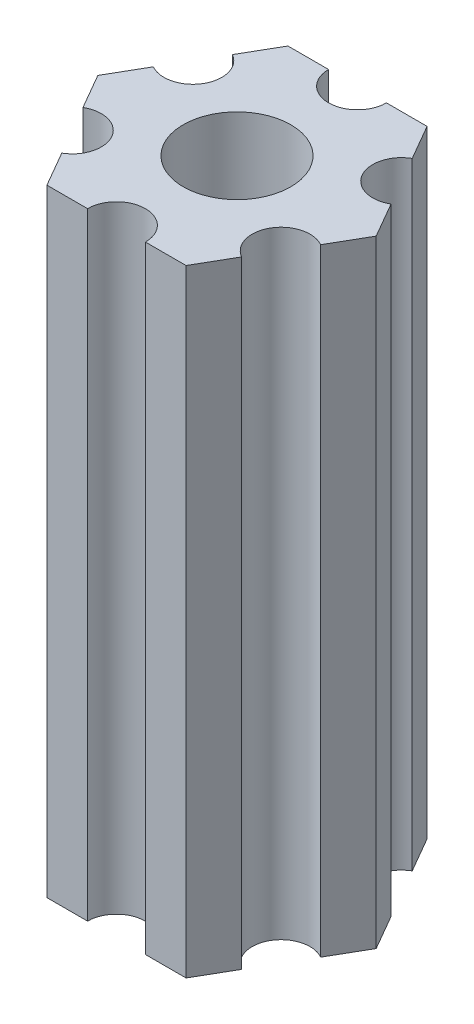
ISO-10303-21;
HEADER;
FILE_DESCRIPTION(('STEP AP214'),'2;1');
FILE_NAME('part.step','',(''),(''),'','','');
FILE_SCHEMA(('AUTOMOTIVE_DESIGN { 1 0 10303 214 1 1 1 1 }'));
ENDSEC;
DATA;
#1=APPLICATION_CONTEXT('core data for automotive mechanical design processes');
#2=APPLICATION_PROTOCOL_DEFINITION('international standard','automotive_design',2000,#1);
#3=PRODUCT_CONTEXT('',#1,'mechanical');
#4=PRODUCT('Part','Part','',(#3));
#5=PRODUCT_RELATED_PRODUCT_CATEGORY('part','',(#4));
#6=PRODUCT_DEFINITION_FORMATION('','',#4);
#7=PRODUCT_DEFINITION_CONTEXT('part definition',#1,'design');
#8=PRODUCT_DEFINITION('design','',#6,#7);
#9=PRODUCT_DEFINITION_SHAPE('','',#8);
#10=(LENGTH_UNIT() NAMED_UNIT(*) SI_UNIT(.MILLI.,.METRE.));
#11=(NAMED_UNIT(*) PLANE_ANGLE_UNIT() SI_UNIT($,.RADIAN.));
#12=(NAMED_UNIT(*) SI_UNIT($,.STERADIAN.) SOLID_ANGLE_UNIT());
#13=UNCERTAINTY_MEASURE_WITH_UNIT(LENGTH_MEASURE(1.E-05),#10,'distance_accuracy_value','');
#14=(GEOMETRIC_REPRESENTATION_CONTEXT(3) GLOBAL_UNCERTAINTY_ASSIGNED_CONTEXT((#13)) GLOBAL_UNIT_ASSIGNED_CONTEXT((#10,
#11,#12)) REPRESENTATION_CONTEXT('',''));
#15=CARTESIAN_POINT('',(0.,0.,0.));
#16=DIRECTION('',(0.,0.,1.));
#17=DIRECTION('',(1.,0.,0.));
#18=AXIS2_PLACEMENT_3D('',#15,#16,#17);
#19=CARTESIAN_POINT('',(5.41265877365274,53.,3.125));
#20=DIRECTION('',(0.,1.,0.));
#21=DIRECTION('',(0.,0.,1.));
#22=AXIS2_PLACEMENT_3D('',#19,#20,#21);
#23=CYLINDRICAL_SURFACE('',#22,1.5);
#24=CARTESIAN_POINT('',(5.41265877365274,85.,3.125));
#25=DIRECTION('',(0.,-1.,0.));
#26=DIRECTION('',(0.,0.,-1.));
#27=AXIS2_PLACEMENT_3D('',#24,#25,#26);
#28=CIRCLE('',#27,1.5);
#29=CARTESIAN_POINT('',(4.66265877365274,85.,4.42403810567666));
#30=VERTEX_POINT('',#29);
#31=CARTESIAN_POINT('',(6.16265877365274,85.,1.82596189432335));
#32=VERTEX_POINT('',#31);
#33=EDGE_CURVE('E194',#30,#32,#28,.T.);
#34=ORIENTED_EDGE('',*,*,#33,.F.);
#35=DIRECTION('',(0.,1.,0.));
#36=VECTOR('',#35,1.);
#37=CARTESIAN_POINT('',(4.66265877365274,53.,4.42403810567666));
#38=LINE('',#37,#36);
#39=CARTESIAN_POINT('',(4.66265877365274,53.,4.42403810567666));
#40=VERTEX_POINT('',#39);
#41=EDGE_CURVE('E11',#40,#30,#38,.T.);
#42=ORIENTED_EDGE('',*,*,#41,.F.);
#43=CARTESIAN_POINT('',(5.41265877365274,53.,3.125));
#44=DIRECTION('',(0.,-1.,0.));
#45=DIRECTION('',(0.,0.,-1.));
#46=AXIS2_PLACEMENT_3D('',#43,#44,#45);
#47=CIRCLE('',#46,1.5);
#48=CARTESIAN_POINT('',(6.16265877365274,53.,1.82596189432335));
#49=VERTEX_POINT('',#48);
#50=EDGE_CURVE('E245',#40,#49,#47,.T.);
#51=ORIENTED_EDGE('',*,*,#50,.T.);
#52=DIRECTION('',(0.,1.,0.));
#53=VECTOR('',#52,1.);
#54=CARTESIAN_POINT('',(6.16265877365274,53.,1.82596189432335));
#55=LINE('',#54,#53);
#56=EDGE_CURVE('E40',#49,#32,#55,.T.);
#57=ORIENTED_EDGE('',*,*,#56,.T.);
#58=EDGE_LOOP('',(#34,#42,#51,#57));
#59=FACE_BOUND('',#58,.T.);
#60=ADVANCED_FACE('F37',(#59),#23,.F.);
#61=CARTESIAN_POINT('',(3.60843918243516,53.,6.25));
#62=DIRECTION('',(0.866025403784439,0.,0.5));
#63=DIRECTION('',(0.5,0.,-0.866025403784439));
#64=AXIS2_PLACEMENT_3D('',#61,#62,#63);
#65=PLANE('',#64);
#66=DIRECTION('',(0.5,0.,-0.866025403784439));
#67=VECTOR('',#66,1.);
#68=CARTESIAN_POINT('',(3.60843918243516,85.,6.25));
#69=LINE('',#68,#67);
#70=CARTESIAN_POINT('',(3.60843918243516,85.,6.25));
#71=VERTEX_POINT('',#70);
#72=EDGE_CURVE('E243',#71,#30,#69,.T.);
#73=ORIENTED_EDGE('',*,*,#72,.F.);
#74=DIRECTION('',(0.,1.,0.));
#75=VECTOR('',#74,1.);
#76=CARTESIAN_POINT('',(3.60843918243516,53.,6.25));
#77=LINE('',#76,#75);
#78=CARTESIAN_POINT('',(3.60843918243516,53.,6.25));
#79=VERTEX_POINT('',#78);
#80=EDGE_CURVE('E46',#79,#71,#77,.T.);
#81=ORIENTED_EDGE('',*,*,#80,.F.);
#82=DIRECTION('',(0.5,0.,-0.866025403784439));
#83=VECTOR('',#82,1.);
#84=CARTESIAN_POINT('',(3.60843918243516,53.,6.25));
#85=LINE('',#84,#83);
#86=EDGE_CURVE('E184',#79,#40,#85,.T.);
#87=ORIENTED_EDGE('',*,*,#86,.T.);
#88=ORIENTED_EDGE('',*,*,#41,.T.);
#89=EDGE_LOOP('',(#73,#81,#87,#88));
#90=FACE_BOUND('',#89,.T.);
#91=ADVANCED_FACE('F277',(#90),#65,.T.);
#92=CARTESIAN_POINT('',(1.5,53.,6.25));
#93=DIRECTION('',(0.,0.,1.));
#94=DIRECTION('',(1.,0.,0.));
#95=AXIS2_PLACEMENT_3D('',#92,#93,#94);
#96=PLANE('',#95);
#97=DIRECTION('',(1.,0.,0.));
#98=VECTOR('',#97,1.);
#99=CARTESIAN_POINT('',(1.5,85.,6.25));
#100=LINE('',#99,#98);
#101=CARTESIAN_POINT('',(1.5,85.,6.25));
#102=VERTEX_POINT('',#101);
#103=EDGE_CURVE('E171',#102,#71,#100,.T.);
#104=ORIENTED_EDGE('',*,*,#103,.F.);
#105=DIRECTION('',(0.,1.,0.));
#106=VECTOR('',#105,1.);
#107=CARTESIAN_POINT('',(1.5,53.,6.25));
#108=LINE('',#107,#106);
#109=CARTESIAN_POINT('',(1.5,53.,6.25));
#110=VERTEX_POINT('',#109);
#111=EDGE_CURVE('E166',#110,#102,#108,.T.);
#112=ORIENTED_EDGE('',*,*,#111,.F.);
#113=DIRECTION('',(1.,0.,0.));
#114=VECTOR('',#113,1.);
#115=CARTESIAN_POINT('',(1.5,53.,6.25));
#116=LINE('',#115,#114);
#117=EDGE_CURVE('E169',#110,#79,#116,.T.);
#118=ORIENTED_EDGE('',*,*,#117,.T.);
#119=ORIENTED_EDGE('',*,*,#80,.T.);
#120=EDGE_LOOP('',(#104,#112,#118,#119));
#121=FACE_BOUND('',#120,.T.);
#122=ADVANCED_FACE('F168',(#121),#96,.T.);
#123=CARTESIAN_POINT('',(0.,53.,6.25));
#124=DIRECTION('',(0.,1.,0.));
#125=DIRECTION('',(0.,0.,1.));
#126=AXIS2_PLACEMENT_3D('',#123,#124,#125);
#127=CYLINDRICAL_SURFACE('',#126,1.5);
#128=CARTESIAN_POINT('',(0.,85.,6.25));
#129=DIRECTION('',(0.,-1.,0.));
#130=DIRECTION('',(0.,0.,-1.));
#131=AXIS2_PLACEMENT_3D('',#128,#129,#130);
#132=CIRCLE('',#131,1.5);
#133=CARTESIAN_POINT('',(-1.5,85.,6.25));
#134=VERTEX_POINT('',#133);
#135=EDGE_CURVE('E240',#134,#102,#132,.T.);
#136=ORIENTED_EDGE('',*,*,#135,.F.);
#137=DIRECTION('',(0.,1.,0.));
#138=VECTOR('',#137,1.);
#139=CARTESIAN_POINT('',(-1.5,53.,6.25));
#140=LINE('',#139,#138);
#141=CARTESIAN_POINT('',(-1.5,53.,6.25));
#142=VERTEX_POINT('',#141);
#143=EDGE_CURVE('E176',#142,#134,#140,.T.);
#144=ORIENTED_EDGE('',*,*,#143,.F.);
#145=CARTESIAN_POINT('',(0.,53.,6.25));
#146=DIRECTION('',(0.,-1.,0.));
#147=DIRECTION('',(0.,0.,-1.));
#148=AXIS2_PLACEMENT_3D('',#145,#146,#147);
#149=CIRCLE('',#148,1.5);
#150=EDGE_CURVE('E182',#142,#110,#149,.T.);
#151=ORIENTED_EDGE('',*,*,#150,.T.);
#152=ORIENTED_EDGE('',*,*,#111,.T.);
#153=EDGE_LOOP('',(#136,#144,#151,#152));
#154=FACE_BOUND('',#153,.T.);
#155=ADVANCED_FACE('F186',(#154),#127,.F.);
#156=CARTESIAN_POINT('',(-3.60843918243516,53.,6.25));
#157=DIRECTION('',(0.,0.,1.));
#158=DIRECTION('',(1.,0.,0.));
#159=AXIS2_PLACEMENT_3D('',#156,#157,#158);
#160=PLANE('',#159);
#161=DIRECTION('',(1.,0.,0.));
#162=VECTOR('',#161,1.);
#163=CARTESIAN_POINT('',(-3.60843918243516,85.,6.25));
#164=LINE('',#163,#162);
#165=CARTESIAN_POINT('',(-3.60843918243516,85.,6.25));
#166=VERTEX_POINT('',#165);
#167=EDGE_CURVE('E237',#166,#134,#164,.T.);
#168=ORIENTED_EDGE('',*,*,#167,.F.);
#169=DIRECTION('',(0.,1.,0.));
#170=VECTOR('',#169,1.);
#171=CARTESIAN_POINT('',(-3.60843918243516,53.,6.25));
#172=LINE('',#171,#170);
#173=CARTESIAN_POINT('',(-3.60843918243516,53.,6.25));
#174=VERTEX_POINT('',#173);
#175=EDGE_CURVE('E249',#174,#166,#172,.T.);
#176=ORIENTED_EDGE('',*,*,#175,.F.);
#177=DIRECTION('',(1.,0.,0.));
#178=VECTOR('',#177,1.);
#179=CARTESIAN_POINT('',(-3.60843918243516,53.,6.25));
#180=LINE('',#179,#178);
#181=EDGE_CURVE('E187',#174,#142,#180,.T.);
#182=ORIENTED_EDGE('',*,*,#181,.T.);
#183=ORIENTED_EDGE('',*,*,#143,.T.);
#184=EDGE_LOOP('',(#168,#176,#182,#183));
#185=FACE_BOUND('',#184,.T.);
#186=ADVANCED_FACE('F290',(#185),#160,.T.);
#187=CARTESIAN_POINT('',(-4.66265877365274,53.,4.42403810567666));
#188=DIRECTION('',(-0.866025403784439,0.,0.5));
#189=DIRECTION('',(0.5,0.,0.866025403784439));
#190=AXIS2_PLACEMENT_3D('',#187,#188,#189);
#191=PLANE('',#190);
#192=DIRECTION('',(0.5,0.,0.866025403784439));
#193=VECTOR('',#192,1.);
#194=CARTESIAN_POINT('',(-4.66265877365274,85.,4.42403810567666));
#195=LINE('',#194,#193);
#196=CARTESIAN_POINT('',(-4.66265877365274,85.,4.42403810567666));
#197=VERTEX_POINT('',#196);
#198=EDGE_CURVE('E234',#197,#166,#195,.T.);
#199=ORIENTED_EDGE('',*,*,#198,.F.);
#200=DIRECTION('',(0.,1.,0.));
#201=VECTOR('',#200,1.);
#202=CARTESIAN_POINT('',(-4.66265877365274,53.,4.42403810567666));
#203=LINE('',#202,#201);
#204=CARTESIAN_POINT('',(-4.66265877365274,53.,4.42403810567666));
#205=VERTEX_POINT('',#204);
#206=EDGE_CURVE('E251',#205,#197,#203,.T.);
#207=ORIENTED_EDGE('',*,*,#206,.F.);
#208=DIRECTION('',(0.5,0.,0.866025403784439));
#209=VECTOR('',#208,1.);
#210=CARTESIAN_POINT('',(-4.66265877365274,53.,4.42403810567666));
#211=LINE('',#210,#209);
#212=EDGE_CURVE('E189',#205,#174,#211,.T.);
#213=ORIENTED_EDGE('',*,*,#212,.T.);
#214=ORIENTED_EDGE('',*,*,#175,.T.);
#215=EDGE_LOOP('',(#199,#207,#213,#214));
#216=FACE_BOUND('',#215,.T.);
#217=ADVANCED_FACE('F293',(#216),#191,.T.);
#218=CARTESIAN_POINT('',(-5.41265877365274,53.,3.125));
#219=DIRECTION('',(0.,1.,0.));
#220=DIRECTION('',(0.,0.,1.));
#221=AXIS2_PLACEMENT_3D('',#218,#219,#220);
#222=CYLINDRICAL_SURFACE('',#221,1.5);
#223=CARTESIAN_POINT('',(-5.41265877365274,85.,3.125));
#224=DIRECTION('',(0.,-1.,0.));
#225=DIRECTION('',(0.,0.,-1.));
#226=AXIS2_PLACEMENT_3D('',#223,#224,#225);
#227=CIRCLE('',#226,1.5);
#228=CARTESIAN_POINT('',(-6.16265877365274,85.,1.82596189432335));
#229=VERTEX_POINT('',#228);
#230=EDGE_CURVE('E231',#229,#197,#227,.T.);
#231=ORIENTED_EDGE('',*,*,#230,.F.);
#232=DIRECTION('',(0.,1.,0.));
#233=VECTOR('',#232,1.);
#234=CARTESIAN_POINT('',(-6.16265877365274,53.,1.82596189432335));
#235=LINE('',#234,#233);
#236=CARTESIAN_POINT('',(-6.16265877365274,53.,1.82596189432335));
#237=VERTEX_POINT('',#236);
#238=EDGE_CURVE('E253',#237,#229,#235,.T.);
#239=ORIENTED_EDGE('',*,*,#238,.F.);
#240=CARTESIAN_POINT('',(-5.41265877365274,53.,3.125));
#241=DIRECTION('',(0.,-1.,0.));
#242=DIRECTION('',(0.,0.,-1.));
#243=AXIS2_PLACEMENT_3D('',#240,#241,#242);
#244=CIRCLE('',#243,1.5);
#245=EDGE_CURVE('E398',#237,#205,#244,.T.);
#246=ORIENTED_EDGE('',*,*,#245,.T.);
#247=ORIENTED_EDGE('',*,*,#206,.T.);
#248=EDGE_LOOP('',(#231,#239,#246,#247));
#249=FACE_BOUND('',#248,.T.);
#250=ADVANCED_FACE('F297',(#249),#222,.F.);
#251=CARTESIAN_POINT('',(-7.21687836487032,53.,0.));
#252=DIRECTION('',(-0.86602540378444,0.,0.499999999999998));
#253=DIRECTION('',(0.499999999999998,0.,0.86602540378444));
#254=AXIS2_PLACEMENT_3D('',#251,#252,#253);
#255=PLANE('',#254);
#256=DIRECTION('',(0.499999999999998,0.,0.86602540378444));
#257=VECTOR('',#256,1.);
#258=CARTESIAN_POINT('',(-7.21687836487032,85.,0.));
#259=LINE('',#258,#257);
#260=CARTESIAN_POINT('',(-7.21687836487032,85.,0.));
#261=VERTEX_POINT('',#260);
#262=EDGE_CURVE('E228',#261,#229,#259,.T.);
#263=ORIENTED_EDGE('',*,*,#262,.F.);
#264=DIRECTION('',(0.,1.,0.));
#265=VECTOR('',#264,1.);
#266=CARTESIAN_POINT('',(-7.21687836487032,53.,0.));
#267=LINE('',#266,#265);
#268=CARTESIAN_POINT('',(-7.21687836487032,53.,0.));
#269=VERTEX_POINT('',#268);
#270=EDGE_CURVE('E255',#269,#261,#267,.T.);
#271=ORIENTED_EDGE('',*,*,#270,.F.);
#272=DIRECTION('',(0.499999999999998,0.,0.86602540378444));
#273=VECTOR('',#272,1.);
#274=CARTESIAN_POINT('',(-7.21687836487032,53.,0.));
#275=LINE('',#274,#273);
#276=EDGE_CURVE('E395',#269,#237,#275,.T.);
#277=ORIENTED_EDGE('',*,*,#276,.T.);
#278=ORIENTED_EDGE('',*,*,#238,.T.);
#279=EDGE_LOOP('',(#263,#271,#277,#278));
#280=FACE_BOUND('',#279,.T.);
#281=ADVANCED_FACE('F301',(#280),#255,.T.);
#282=CARTESIAN_POINT('',(-6.16265877365274,53.,-1.82596189432334));
#283=DIRECTION('',(-0.866025403784438,0.,-0.5));
#284=DIRECTION('',(-0.5,0.,0.866025403784438));
#285=AXIS2_PLACEMENT_3D('',#282,#283,#284);
#286=PLANE('',#285);
#287=DIRECTION('',(-0.5,0.,0.866025403784438));
#288=VECTOR('',#287,1.);
#289=CARTESIAN_POINT('',(-6.16265877365274,85.,-1.82596189432334));
#290=LINE('',#289,#288);
#291=CARTESIAN_POINT('',(-6.16265877365274,85.,-1.82596189432334));
#292=VERTEX_POINT('',#291);
#293=EDGE_CURVE('E225',#292,#261,#290,.T.);
#294=ORIENTED_EDGE('',*,*,#293,.F.);
#295=DIRECTION('',(0.,1.,0.));
#296=VECTOR('',#295,1.);
#297=CARTESIAN_POINT('',(-6.16265877365274,53.,-1.82596189432334));
#298=LINE('',#297,#296);
#299=CARTESIAN_POINT('',(-6.16265877365274,53.,-1.82596189432334));
#300=VERTEX_POINT('',#299);
#301=EDGE_CURVE('E257',#300,#292,#298,.T.);
#302=ORIENTED_EDGE('',*,*,#301,.F.);
#303=DIRECTION('',(-0.5,0.,0.866025403784438));
#304=VECTOR('',#303,1.);
#305=CARTESIAN_POINT('',(-6.16265877365274,53.,-1.82596189432334));
#306=LINE('',#305,#304);
#307=EDGE_CURVE('E392',#300,#269,#306,.T.);
#308=ORIENTED_EDGE('',*,*,#307,.T.);
#309=ORIENTED_EDGE('',*,*,#270,.T.);
#310=EDGE_LOOP('',(#294,#302,#308,#309));
#311=FACE_BOUND('',#310,.T.);
#312=ADVANCED_FACE('F305',(#311),#286,.T.);
#313=CARTESIAN_POINT('',(-5.41265877365274,53.,-3.125));
#314=DIRECTION('',(0.,1.,0.));
#315=DIRECTION('',(0.,0.,1.));
#316=AXIS2_PLACEMENT_3D('',#313,#314,#315);
#317=CYLINDRICAL_SURFACE('',#316,1.5);
#318=CARTESIAN_POINT('',(-5.41265877365274,85.,-3.125));
#319=DIRECTION('',(0.,-1.,0.));
#320=DIRECTION('',(0.,0.,-1.));
#321=AXIS2_PLACEMENT_3D('',#318,#319,#320);
#322=CIRCLE('',#321,1.5);
#323=CARTESIAN_POINT('',(-4.66265877365274,85.,-4.42403810567666));
#324=VERTEX_POINT('',#323);
#325=EDGE_CURVE('E222',#324,#292,#322,.T.);
#326=ORIENTED_EDGE('',*,*,#325,.F.);
#327=DIRECTION('',(0.,1.,0.));
#328=VECTOR('',#327,1.);
#329=CARTESIAN_POINT('',(-4.66265877365274,53.,-4.42403810567666));
#330=LINE('',#329,#328);
#331=CARTESIAN_POINT('',(-4.66265877365274,53.,-4.42403810567666));
#332=VERTEX_POINT('',#331);
#333=EDGE_CURVE('E259',#332,#324,#330,.T.);
#334=ORIENTED_EDGE('',*,*,#333,.F.);
#335=CARTESIAN_POINT('',(-5.41265877365274,53.,-3.125));
#336=DIRECTION('',(0.,-1.,0.));
#337=DIRECTION('',(0.,0.,-1.));
#338=AXIS2_PLACEMENT_3D('',#335,#336,#337);
#339=CIRCLE('',#338,1.5);
#340=EDGE_CURVE('E389',#332,#300,#339,.T.);
#341=ORIENTED_EDGE('',*,*,#340,.T.);
#342=ORIENTED_EDGE('',*,*,#301,.T.);
#343=EDGE_LOOP('',(#326,#334,#341,#342));
#344=FACE_BOUND('',#343,.T.);
#345=ADVANCED_FACE('F309',(#344),#317,.F.);
#346=CARTESIAN_POINT('',(-3.60843918243516,53.,-6.25));
#347=DIRECTION('',(-0.866025403784439,0.,-0.5));
#348=DIRECTION('',(-0.5,0.,0.866025403784439));
#349=AXIS2_PLACEMENT_3D('',#346,#347,#348);
#350=PLANE('',#349);
#351=DIRECTION('',(-0.5,0.,0.866025403784439));
#352=VECTOR('',#351,1.);
#353=CARTESIAN_POINT('',(-3.60843918243516,85.,-6.25));
#354=LINE('',#353,#352);
#355=CARTESIAN_POINT('',(-3.60843918243516,85.,-6.25));
#356=VERTEX_POINT('',#355);
#357=EDGE_CURVE('E219',#356,#324,#354,.T.);
#358=ORIENTED_EDGE('',*,*,#357,.F.);
#359=DIRECTION('',(0.,1.,0.));
#360=VECTOR('',#359,1.);
#361=CARTESIAN_POINT('',(-3.60843918243516,53.,-6.25));
#362=LINE('',#361,#360);
#363=CARTESIAN_POINT('',(-3.60843918243516,53.,-6.25));
#364=VERTEX_POINT('',#363);
#365=EDGE_CURVE('E261',#364,#356,#362,.T.);
#366=ORIENTED_EDGE('',*,*,#365,.F.);
#367=DIRECTION('',(-0.5,0.,0.866025403784439));
#368=VECTOR('',#367,1.);
#369=CARTESIAN_POINT('',(-3.60843918243516,53.,-6.25));
#370=LINE('',#369,#368);
#371=EDGE_CURVE('E386',#364,#332,#370,.T.);
#372=ORIENTED_EDGE('',*,*,#371,.T.);
#373=ORIENTED_EDGE('',*,*,#333,.T.);
#374=EDGE_LOOP('',(#358,#366,#372,#373));
#375=FACE_BOUND('',#374,.T.);
#376=ADVANCED_FACE('F313',(#375),#350,.T.);
#377=CARTESIAN_POINT('',(-1.5,53.,-6.25));
#378=DIRECTION('',(0.,0.,-1.));
#379=DIRECTION('',(-1.,0.,0.));
#380=AXIS2_PLACEMENT_3D('',#377,#378,#379);
#381=PLANE('',#380);
#382=DIRECTION('',(-1.,0.,0.));
#383=VECTOR('',#382,1.);
#384=CARTESIAN_POINT('',(-1.5,85.,-6.25));
#385=LINE('',#384,#383);
#386=CARTESIAN_POINT('',(-1.5,85.,-6.25));
#387=VERTEX_POINT('',#386);
#388=EDGE_CURVE('E216',#387,#356,#385,.T.);
#389=ORIENTED_EDGE('',*,*,#388,.F.);
#390=DIRECTION('',(0.,1.,0.));
#391=VECTOR('',#390,1.);
#392=CARTESIAN_POINT('',(-1.5,53.,-6.25));
#393=LINE('',#392,#391);
#394=CARTESIAN_POINT('',(-1.5,53.,-6.25));
#395=VERTEX_POINT('',#394);
#396=EDGE_CURVE('E263',#395,#387,#393,.T.);
#397=ORIENTED_EDGE('',*,*,#396,.F.);
#398=DIRECTION('',(-1.,0.,0.));
#399=VECTOR('',#398,1.);
#400=CARTESIAN_POINT('',(-1.5,53.,-6.25));
#401=LINE('',#400,#399);
#402=EDGE_CURVE('E383',#395,#364,#401,.T.);
#403=ORIENTED_EDGE('',*,*,#402,.T.);
#404=ORIENTED_EDGE('',*,*,#365,.T.);
#405=EDGE_LOOP('',(#389,#397,#403,#404));
#406=FACE_BOUND('',#405,.T.);
#407=ADVANCED_FACE('F317',(#406),#381,.T.);
#408=CARTESIAN_POINT('',(0.,53.,-6.25));
#409=DIRECTION('',(0.,1.,0.));
#410=DIRECTION('',(0.,0.,1.));
#411=AXIS2_PLACEMENT_3D('',#408,#409,#410);
#412=CYLINDRICAL_SURFACE('',#411,1.5);
#413=CARTESIAN_POINT('',(0.,85.,-6.25));
#414=DIRECTION('',(0.,-1.,0.));
#415=DIRECTION('',(0.,0.,-1.));
#416=AXIS2_PLACEMENT_3D('',#413,#414,#415);
#417=CIRCLE('',#416,1.5);
#418=CARTESIAN_POINT('',(1.5,85.,-6.25));
#419=VERTEX_POINT('',#418);
#420=EDGE_CURVE('E213',#419,#387,#417,.T.);
#421=ORIENTED_EDGE('',*,*,#420,.F.);
#422=DIRECTION('',(0.,1.,0.));
#423=VECTOR('',#422,1.);
#424=CARTESIAN_POINT('',(1.5,53.,-6.25));
#425=LINE('',#424,#423);
#426=CARTESIAN_POINT('',(1.5,53.,-6.25));
#427=VERTEX_POINT('',#426);
#428=EDGE_CURVE('E265',#427,#419,#425,.T.);
#429=ORIENTED_EDGE('',*,*,#428,.F.);
#430=CARTESIAN_POINT('',(0.,53.,-6.25));
#431=DIRECTION('',(0.,-1.,0.));
#432=DIRECTION('',(0.,0.,-1.));
#433=AXIS2_PLACEMENT_3D('',#430,#431,#432);
#434=CIRCLE('',#433,1.5);
#435=EDGE_CURVE('E380',#427,#395,#434,.T.);
#436=ORIENTED_EDGE('',*,*,#435,.T.);
#437=ORIENTED_EDGE('',*,*,#396,.T.);
#438=EDGE_LOOP('',(#421,#429,#436,#437));
#439=FACE_BOUND('',#438,.T.);
#440=ADVANCED_FACE('F321',(#439),#412,.F.);
#441=CARTESIAN_POINT('',(3.60843918243516,53.,-6.25));
#442=DIRECTION('',(0.,0.,-1.));
#443=DIRECTION('',(-1.,0.,0.));
#444=AXIS2_PLACEMENT_3D('',#441,#442,#443);
#445=PLANE('',#444);
#446=DIRECTION('',(-1.,0.,0.));
#447=VECTOR('',#446,1.);
#448=CARTESIAN_POINT('',(3.60843918243516,85.,-6.25));
#449=LINE('',#448,#447);
#450=CARTESIAN_POINT('',(3.60843918243516,85.,-6.25));
#451=VERTEX_POINT('',#450);
#452=EDGE_CURVE('E210',#451,#419,#449,.T.);
#453=ORIENTED_EDGE('',*,*,#452,.F.);
#454=DIRECTION('',(0.,1.,0.));
#455=VECTOR('',#454,1.);
#456=CARTESIAN_POINT('',(3.60843918243516,53.,-6.25));
#457=LINE('',#456,#455);
#458=CARTESIAN_POINT('',(3.60843918243516,53.,-6.25));
#459=VERTEX_POINT('',#458);
#460=EDGE_CURVE('E267',#459,#451,#457,.T.);
#461=ORIENTED_EDGE('',*,*,#460,.F.);
#462=DIRECTION('',(-1.,0.,0.));
#463=VECTOR('',#462,1.);
#464=CARTESIAN_POINT('',(3.60843918243516,53.,-6.25));
#465=LINE('',#464,#463);
#466=EDGE_CURVE('E377',#459,#427,#465,.T.);
#467=ORIENTED_EDGE('',*,*,#466,.T.);
#468=ORIENTED_EDGE('',*,*,#428,.T.);
#469=EDGE_LOOP('',(#453,#461,#467,#468));
#470=FACE_BOUND('',#469,.T.);
#471=ADVANCED_FACE('F325',(#470),#445,.T.);
#472=CARTESIAN_POINT('',(4.66265877365274,53.,-4.42403810567666));
#473=DIRECTION('',(0.866025403784439,0.,-0.5));
#474=DIRECTION('',(-0.5,0.,-0.866025403784439));
#475=AXIS2_PLACEMENT_3D('',#472,#473,#474);
#476=PLANE('',#475);
#477=DIRECTION('',(-0.5,0.,-0.866025403784439));
#478=VECTOR('',#477,1.);
#479=CARTESIAN_POINT('',(4.66265877365274,85.,-4.42403810567666));
#480=LINE('',#479,#478);
#481=CARTESIAN_POINT('',(4.66265877365274,85.,-4.42403810567666));
#482=VERTEX_POINT('',#481);
#483=EDGE_CURVE('E207',#482,#451,#480,.T.);
#484=ORIENTED_EDGE('',*,*,#483,.F.);
#485=DIRECTION('',(0.,1.,0.));
#486=VECTOR('',#485,1.);
#487=CARTESIAN_POINT('',(4.66265877365274,53.,-4.42403810567666));
#488=LINE('',#487,#486);
#489=CARTESIAN_POINT('',(4.66265877365274,53.,-4.42403810567666));
#490=VERTEX_POINT('',#489);
#491=EDGE_CURVE('E269',#490,#482,#488,.T.);
#492=ORIENTED_EDGE('',*,*,#491,.F.);
#493=DIRECTION('',(-0.5,0.,-0.866025403784439));
#494=VECTOR('',#493,1.);
#495=CARTESIAN_POINT('',(4.66265877365274,53.,-4.42403810567666));
#496=LINE('',#495,#494);
#497=EDGE_CURVE('E374',#490,#459,#496,.T.);
#498=ORIENTED_EDGE('',*,*,#497,.T.);
#499=ORIENTED_EDGE('',*,*,#460,.T.);
#500=EDGE_LOOP('',(#484,#492,#498,#499));
#501=FACE_BOUND('',#500,.T.);
#502=ADVANCED_FACE('F329',(#501),#476,.T.);
#503=CARTESIAN_POINT('',(5.41265877365274,53.,-3.125));
#504=DIRECTION('',(0.,1.,0.));
#505=DIRECTION('',(0.,0.,1.));
#506=AXIS2_PLACEMENT_3D('',#503,#504,#505);
#507=CYLINDRICAL_SURFACE('',#506,1.5);
#508=CARTESIAN_POINT('',(5.41265877365274,85.,-3.125));
#509=DIRECTION('',(0.,-1.,0.));
#510=DIRECTION('',(0.,0.,-1.));
#511=AXIS2_PLACEMENT_3D('',#508,#509,#510);
#512=CIRCLE('',#511,1.5);
#513=CARTESIAN_POINT('',(6.16265877365274,85.,-1.82596189432334));
#514=VERTEX_POINT('',#513);
#515=EDGE_CURVE('E204',#514,#482,#512,.T.);
#516=ORIENTED_EDGE('',*,*,#515,.F.);
#517=DIRECTION('',(0.,1.,0.));
#518=VECTOR('',#517,1.);
#519=CARTESIAN_POINT('',(6.16265877365274,53.,-1.82596189432334));
#520=LINE('',#519,#518);
#521=CARTESIAN_POINT('',(6.16265877365274,53.,-1.82596189432334));
#522=VERTEX_POINT('',#521);
#523=EDGE_CURVE('E271',#522,#514,#520,.T.);
#524=ORIENTED_EDGE('',*,*,#523,.F.);
#525=CARTESIAN_POINT('',(5.41265877365274,53.,-3.125));
#526=DIRECTION('',(0.,-1.,0.));
#527=DIRECTION('',(0.,0.,-1.));
#528=AXIS2_PLACEMENT_3D('',#525,#526,#527);
#529=CIRCLE('',#528,1.5);
#530=EDGE_CURVE('E371',#522,#490,#529,.T.);
#531=ORIENTED_EDGE('',*,*,#530,.T.);
#532=ORIENTED_EDGE('',*,*,#491,.T.);
#533=EDGE_LOOP('',(#516,#524,#531,#532));
#534=FACE_BOUND('',#533,.T.);
#535=ADVANCED_FACE('F333',(#534),#507,.F.);
#536=CARTESIAN_POINT('',(7.21687836487032,53.,0.));
#537=DIRECTION('',(0.866025403784439,0.,-0.5));
#538=DIRECTION('',(-0.5,0.,-0.866025403784439));
#539=AXIS2_PLACEMENT_3D('',#536,#537,#538);
#540=PLANE('',#539);
#541=DIRECTION('',(-0.5,0.,-0.866025403784439));
#542=VECTOR('',#541,1.);
#543=CARTESIAN_POINT('',(7.21687836487032,85.,0.));
#544=LINE('',#543,#542);
#545=CARTESIAN_POINT('',(7.21687836487032,85.,0.));
#546=VERTEX_POINT('',#545);
#547=EDGE_CURVE('E201',#546,#514,#544,.T.);
#548=ORIENTED_EDGE('',*,*,#547,.F.);
#549=DIRECTION('',(0.,1.,0.));
#550=VECTOR('',#549,1.);
#551=CARTESIAN_POINT('',(7.21687836487032,53.,0.));
#552=LINE('',#551,#550);
#553=CARTESIAN_POINT('',(7.21687836487032,53.,0.));
#554=VERTEX_POINT('',#553);
#555=EDGE_CURVE('E272',#554,#546,#552,.T.);
#556=ORIENTED_EDGE('',*,*,#555,.F.);
#557=DIRECTION('',(-0.5,0.,-0.866025403784439));
#558=VECTOR('',#557,1.);
#559=CARTESIAN_POINT('',(7.21687836487032,53.,0.));
#560=LINE('',#559,#558);
#561=EDGE_CURVE('E368',#554,#522,#560,.T.);
#562=ORIENTED_EDGE('',*,*,#561,.T.);
#563=ORIENTED_EDGE('',*,*,#523,.T.);
#564=EDGE_LOOP('',(#548,#556,#562,#563));
#565=FACE_BOUND('',#564,.T.);
#566=ADVANCED_FACE('F337',(#565),#540,.T.);
#567=CARTESIAN_POINT('',(6.16265877365274,53.,1.82596189432335));
#568=DIRECTION('',(0.86602540378444,0.,0.499999999999999));
#569=DIRECTION('',(0.499999999999999,0.,-0.86602540378444));
#570=AXIS2_PLACEMENT_3D('',#567,#568,#569);
#571=PLANE('',#570);
#572=DIRECTION('',(0.499999999999999,0.,-0.86602540378444));
#573=VECTOR('',#572,1.);
#574=CARTESIAN_POINT('',(6.16265877365274,85.,1.82596189432335));
#575=LINE('',#574,#573);
#576=EDGE_CURVE('E197',#32,#546,#575,.T.);
#577=ORIENTED_EDGE('',*,*,#576,.F.);
#578=ORIENTED_EDGE('',*,*,#56,.F.);
#579=DIRECTION('',(0.499999999999999,0.,-0.86602540378444));
#580=VECTOR('',#579,1.);
#581=CARTESIAN_POINT('',(6.16265877365274,53.,1.82596189432335));
#582=LINE('',#581,#580);
#583=EDGE_CURVE('E366',#49,#554,#582,.T.);
#584=ORIENTED_EDGE('',*,*,#583,.T.);
#585=ORIENTED_EDGE('',*,*,#555,.T.);
#586=EDGE_LOOP('',(#577,#578,#584,#585));
#587=FACE_BOUND('',#586,.T.);
#588=ADVANCED_FACE('F274',(#587),#571,.T.);
#589=CARTESIAN_POINT('',(5.41265877365274,53.,3.125));
#590=DIRECTION('',(0.,-1.,0.));
#591=DIRECTION('',(0.,0.,-1.));
#592=AXIS2_PLACEMENT_3D('',#589,#590,#591);
#593=PLANE('',#592);
#594=CARTESIAN_POINT('',(0.,53.,0.));
#595=DIRECTION('',(0.,1.,0.));
#596=DIRECTION('',(0.,0.,-1.));
#597=AXIS2_PLACEMENT_3D('',#594,#595,#596);
#598=CIRCLE('',#597,2.79);
#599=CARTESIAN_POINT('',(0.,53.,-2.79));
#600=VERTEX_POINT('',#599);
#601=EDGE_CURVE('E198',#600,#600,#598,.T.);
#602=ORIENTED_EDGE('',*,*,#601,.T.);
#603=EDGE_LOOP('',(#602));
#604=FACE_BOUND('',#603,.T.);
#605=ORIENTED_EDGE('',*,*,#50,.F.);
#606=ORIENTED_EDGE('',*,*,#86,.F.);
#607=ORIENTED_EDGE('',*,*,#117,.F.);
#608=ORIENTED_EDGE('',*,*,#150,.F.);
#609=ORIENTED_EDGE('',*,*,#181,.F.);
#610=ORIENTED_EDGE('',*,*,#212,.F.);
#611=ORIENTED_EDGE('',*,*,#245,.F.);
#612=ORIENTED_EDGE('',*,*,#276,.F.);
#613=ORIENTED_EDGE('',*,*,#307,.F.);
#614=ORIENTED_EDGE('',*,*,#340,.F.);
#615=ORIENTED_EDGE('',*,*,#371,.F.);
#616=ORIENTED_EDGE('',*,*,#402,.F.);
#617=ORIENTED_EDGE('',*,*,#435,.F.);
#618=ORIENTED_EDGE('',*,*,#466,.F.);
#619=ORIENTED_EDGE('',*,*,#497,.F.);
#620=ORIENTED_EDGE('',*,*,#530,.F.);
#621=ORIENTED_EDGE('',*,*,#561,.F.);
#622=ORIENTED_EDGE('',*,*,#583,.F.);
#623=EDGE_LOOP('',(#605,#606,#607,#608,#609,#610,#611,#612,#613,#614,#615,#616,#617,#618,#619,
#620,#621,#622));
#624=FACE_BOUND('',#623,.T.);
#625=ADVANCED_FACE('F180',(#604,#624),#593,.T.);
#626=CARTESIAN_POINT('',(5.41265877365274,85.,3.125));
#627=DIRECTION('',(0.,-1.,0.));
#628=DIRECTION('',(0.,0.,-1.));
#629=AXIS2_PLACEMENT_3D('',#626,#627,#628);
#630=PLANE('',#629);
#631=CARTESIAN_POINT('',(0.,85.,0.));
#632=DIRECTION('',(0.,1.,0.));
#633=DIRECTION('',(0.,0.,-1.));
#634=AXIS2_PLACEMENT_3D('',#631,#632,#633);
#635=CIRCLE('',#634,2.79);
#636=CARTESIAN_POINT('',(0.,85.,-2.79));
#637=VERTEX_POINT('',#636);
#638=EDGE_CURVE('E361',#637,#637,#635,.T.);
#639=ORIENTED_EDGE('',*,*,#638,.F.);
#640=EDGE_LOOP('',(#639));
#641=FACE_BOUND('',#640,.T.);
#642=ORIENTED_EDGE('',*,*,#33,.T.);
#643=ORIENTED_EDGE('',*,*,#576,.T.);
#644=ORIENTED_EDGE('',*,*,#547,.T.);
#645=ORIENTED_EDGE('',*,*,#515,.T.);
#646=ORIENTED_EDGE('',*,*,#483,.T.);
#647=ORIENTED_EDGE('',*,*,#452,.T.);
#648=ORIENTED_EDGE('',*,*,#420,.T.);
#649=ORIENTED_EDGE('',*,*,#388,.T.);
#650=ORIENTED_EDGE('',*,*,#357,.T.);
#651=ORIENTED_EDGE('',*,*,#325,.T.);
#652=ORIENTED_EDGE('',*,*,#293,.T.);
#653=ORIENTED_EDGE('',*,*,#262,.T.);
#654=ORIENTED_EDGE('',*,*,#230,.T.);
#655=ORIENTED_EDGE('',*,*,#198,.T.);
#656=ORIENTED_EDGE('',*,*,#167,.T.);
#657=ORIENTED_EDGE('',*,*,#135,.T.);
#658=ORIENTED_EDGE('',*,*,#103,.T.);
#659=ORIENTED_EDGE('',*,*,#72,.T.);
#660=EDGE_LOOP('',(#642,#643,#644,#645,#646,#647,#648,#649,#650,#651,#652,#653,#654,#655,#656,
#657,#658,#659));
#661=FACE_BOUND('',#660,.T.);
#662=ADVANCED_FACE('F276',(#641,#661),#630,.F.);
#663=CARTESIAN_POINT('',(0.,53.,0.));
#664=DIRECTION('',(0.,1.,0.));
#665=DIRECTION('',(0.,0.,1.));
#666=AXIS2_PLACEMENT_3D('',#663,#664,#665);
#667=CYLINDRICAL_SURFACE('',#666,2.79);
#668=ORIENTED_EDGE('',*,*,#601,.F.);
#669=EDGE_LOOP('',(#668));
#670=FACE_BOUND('',#669,.T.);
#671=ORIENTED_EDGE('',*,*,#638,.T.);
#672=EDGE_LOOP('',(#671));
#673=FACE_BOUND('',#672,.T.);
#674=ADVANCED_FACE('F349',(#670,#673),#667,.F.);
#675=CLOSED_SHELL('',(#60,#91,#122,#155,#186,#217,#250,#281,#312,#345,#376,#407,#440,#471,#502,
#535,#566,#588,#625,#662,#674));
#676=MANIFOLD_SOLID_BREP('B2',#675);
#677=ADVANCED_BREP_SHAPE_REPRESENTATION('',(#18,#676),#14);
#678=SHAPE_DEFINITION_REPRESENTATION(#9,#677);
ENDSEC;
END-ISO-10303-21;
